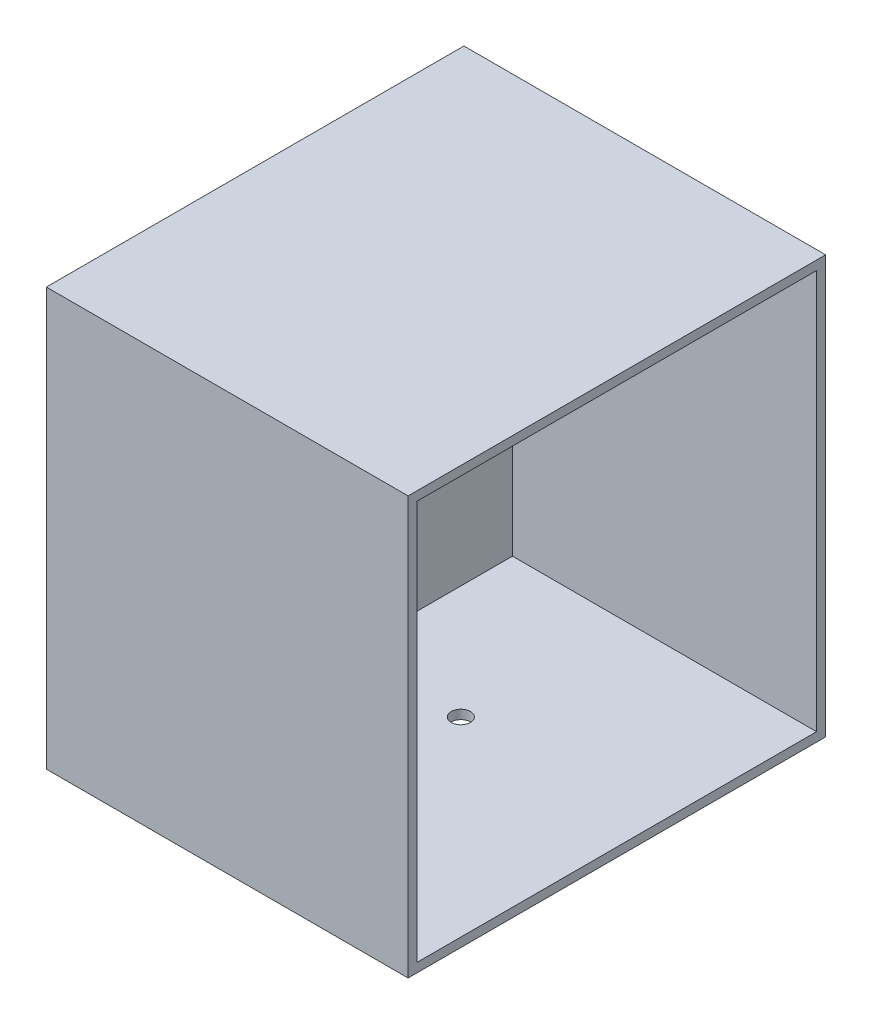
ISO-10303-21;
HEADER;
FILE_DESCRIPTION(('STEP AP214'),'2;1');
FILE_NAME('part.step','',(''),(''),'','','');
FILE_SCHEMA(('AUTOMOTIVE_DESIGN { 1 0 10303 214 1 1 1 1 }'));
ENDSEC;
DATA;
#1=APPLICATION_CONTEXT('core data for automotive mechanical design processes');
#2=APPLICATION_PROTOCOL_DEFINITION('international standard','automotive_design',2000,#1);
#3=PRODUCT_CONTEXT('',#1,'mechanical');
#4=PRODUCT('Part','Part','',(#3));
#5=PRODUCT_RELATED_PRODUCT_CATEGORY('part','',(#4));
#6=PRODUCT_DEFINITION_FORMATION('','',#4);
#7=PRODUCT_DEFINITION_CONTEXT('part definition',#1,'design');
#8=PRODUCT_DEFINITION('design','',#6,#7);
#9=PRODUCT_DEFINITION_SHAPE('','',#8);
#10=(LENGTH_UNIT() NAMED_UNIT(*) SI_UNIT(.MILLI.,.METRE.));
#11=(NAMED_UNIT(*) PLANE_ANGLE_UNIT() SI_UNIT($,.RADIAN.));
#12=(NAMED_UNIT(*) SI_UNIT($,.STERADIAN.) SOLID_ANGLE_UNIT());
#13=UNCERTAINTY_MEASURE_WITH_UNIT(LENGTH_MEASURE(1.E-05),#10,'distance_accuracy_value','');
#14=(GEOMETRIC_REPRESENTATION_CONTEXT(3) GLOBAL_UNCERTAINTY_ASSIGNED_CONTEXT((#13)) GLOBAL_UNIT_ASSIGNED_CONTEXT((#10,
#11,#12)) REPRESENTATION_CONTEXT('',''));
#15=CARTESIAN_POINT('',(0.,0.,0.));
#16=DIRECTION('',(0.,0.,1.));
#17=DIRECTION('',(1.,0.,0.));
#18=AXIS2_PLACEMENT_3D('',#15,#16,#17);
#19=CARTESIAN_POINT('',(12.7,0.,0.));
#20=DIRECTION('',(1.,0.,0.));
#21=DIRECTION('',(0.,0.,-1.));
#22=AXIS2_PLACEMENT_3D('',#19,#20,#21);
#23=PLANE('',#22);
#24=CARTESIAN_POINT('',(12.7,0.,0.));
#25=DIRECTION('',(1.,0.,0.));
#26=DIRECTION('',(0.,0.,-1.));
#27=AXIS2_PLACEMENT_3D('',#24,#25,#26);
#28=CIRCLE('',#27,27.305);
#29=CARTESIAN_POINT('',(12.7,0.,-27.305));
#30=VERTEX_POINT('',#29);
#31=EDGE_CURVE('E109',#30,#30,#28,.T.);
#32=ORIENTED_EDGE('',*,*,#31,.F.);
#33=EDGE_LOOP('',(#32));
#34=FACE_BOUND('',#33,.T.);
#35=DIRECTION('',(0.,1.,0.));
#36=VECTOR('',#35,1.);
#37=CARTESIAN_POINT('',(12.7,0.,44.));
#38=LINE('',#37,#36);
#39=CARTESIAN_POINT('',(12.7,-44.,44.));
#40=VERTEX_POINT('',#39);
#41=CARTESIAN_POINT('',(12.7,44.,44.));
#42=VERTEX_POINT('',#41);
#43=EDGE_CURVE('E50',#40,#42,#38,.T.);
#44=ORIENTED_EDGE('',*,*,#43,.F.);
#45=DIRECTION('',(0.,0.,1.));
#46=VECTOR('',#45,1.);
#47=CARTESIAN_POINT('',(12.7,-44.,0.));
#48=LINE('',#47,#46);
#49=CARTESIAN_POINT('',(12.7,-44.,-44.));
#50=VERTEX_POINT('',#49);
#51=EDGE_CURVE('E145',#50,#40,#48,.T.);
#52=ORIENTED_EDGE('',*,*,#51,.F.);
#53=DIRECTION('',(0.,1.,0.));
#54=VECTOR('',#53,1.);
#55=CARTESIAN_POINT('',(12.7,0.,-44.));
#56=LINE('',#55,#54);
#57=CARTESIAN_POINT('',(12.7,44.,-44.));
#58=VERTEX_POINT('',#57);
#59=EDGE_CURVE('E124',#50,#58,#56,.T.);
#60=ORIENTED_EDGE('',*,*,#59,.T.);
#61=DIRECTION('',(0.,0.,1.));
#62=VECTOR('',#61,1.);
#63=CARTESIAN_POINT('',(12.7,44.,0.));
#64=LINE('',#63,#62);
#65=EDGE_CURVE('E55',#58,#42,#64,.T.);
#66=ORIENTED_EDGE('',*,*,#65,.T.);
#67=EDGE_LOOP('',(#44,#52,#60,#66));
#68=FACE_BOUND('',#67,.T.);
#69=ADVANCED_FACE('F35',(#34,#68),#23,.T.);
#70=CARTESIAN_POINT('',(12.7,0.,46.));
#71=DIRECTION('',(0.,0.,1.));
#72=DIRECTION('',(1.,0.,0.));
#73=AXIS2_PLACEMENT_3D('',#70,#71,#72);
#74=PLANE('',#73);
#75=DIRECTION('',(0.,1.,0.));
#76=VECTOR('',#75,1.);
#77=CARTESIAN_POINT('',(0.,0.,46.));
#78=LINE('',#77,#76);
#79=CARTESIAN_POINT('',(0.,-46.,46.));
#80=VERTEX_POINT('',#79);
#81=CARTESIAN_POINT('',(0.,46.,46.));
#82=VERTEX_POINT('',#81);
#83=EDGE_CURVE('E164',#80,#82,#78,.T.);
#84=ORIENTED_EDGE('',*,*,#83,.F.);
#85=DIRECTION('',(-1.,0.,0.));
#86=VECTOR('',#85,1.);
#87=CARTESIAN_POINT('',(12.7,-46.,46.));
#88=LINE('',#87,#86);
#89=CARTESIAN_POINT('',(79.7,-46.,46.));
#90=VERTEX_POINT('',#89);
#91=EDGE_CURVE('E11',#90,#80,#88,.T.);
#92=ORIENTED_EDGE('',*,*,#91,.F.);
#93=DIRECTION('',(0.,-1.,0.));
#94=VECTOR('',#93,1.);
#95=CARTESIAN_POINT('',(79.7,0.,46.));
#96=LINE('',#95,#94);
#97=CARTESIAN_POINT('',(79.7,46.,46.));
#98=VERTEX_POINT('',#97);
#99=EDGE_CURVE('E112',#98,#90,#96,.T.);
#100=ORIENTED_EDGE('',*,*,#99,.F.);
#101=DIRECTION('',(-1.,0.,0.));
#102=VECTOR('',#101,1.);
#103=CARTESIAN_POINT('',(12.7,46.,46.));
#104=LINE('',#103,#102);
#105=EDGE_CURVE('E98',#98,#82,#104,.T.);
#106=ORIENTED_EDGE('',*,*,#105,.T.);
#107=EDGE_LOOP('',(#84,#92,#100,#106));
#108=FACE_BOUND('',#107,.T.);
#109=ADVANCED_FACE('F113',(#108),#74,.T.);
#110=CARTESIAN_POINT('',(12.7,-46.,0.));
#111=DIRECTION('',(0.,-1.,0.));
#112=DIRECTION('',(0.,0.,-1.));
#113=AXIS2_PLACEMENT_3D('',#110,#111,#112);
#114=PLANE('',#113);
#115=CARTESIAN_POINT('',(37.7,-46.,-7.61999999999999));
#116=DIRECTION('',(0.,-1.,0.));
#117=DIRECTION('',(0.,0.,-1.));
#118=AXIS2_PLACEMENT_3D('',#115,#116,#117);
#119=CIRCLE('',#118,2.1082);
#120=CARTESIAN_POINT('',(37.7,-46.,-9.72819999999999));
#121=VERTEX_POINT('',#120);
#122=EDGE_CURVE('E306',#121,#121,#119,.T.);
#123=ORIENTED_EDGE('',*,*,#122,.F.);
#124=EDGE_LOOP('',(#123));
#125=FACE_BOUND('',#124,.T.);
#126=CARTESIAN_POINT('',(37.7,-46.,7.62));
#127=DIRECTION('',(0.,-1.,0.));
#128=DIRECTION('',(0.,0.,-1.));
#129=AXIS2_PLACEMENT_3D('',#126,#127,#128);
#130=CIRCLE('',#129,2.1082);
#131=CARTESIAN_POINT('',(37.7,-46.,5.51180000000001));
#132=VERTEX_POINT('',#131);
#133=EDGE_CURVE('E308',#132,#132,#130,.T.);
#134=ORIENTED_EDGE('',*,*,#133,.F.);
#135=EDGE_LOOP('',(#134));
#136=FACE_BOUND('',#135,.T.);
#137=DIRECTION('',(0.,0.,1.));
#138=VECTOR('',#137,1.);
#139=CARTESIAN_POINT('',(0.,-46.,0.));
#140=LINE('',#139,#138);
#141=CARTESIAN_POINT('',(0.,-46.,-46.));
#142=VERTEX_POINT('',#141);
#143=EDGE_CURVE('E166',#142,#80,#140,.T.);
#144=ORIENTED_EDGE('',*,*,#143,.F.);
#145=DIRECTION('',(-1.,0.,0.));
#146=VECTOR('',#145,1.);
#147=CARTESIAN_POINT('',(12.7,-46.,-46.));
#148=LINE('',#147,#146);
#149=CARTESIAN_POINT('',(79.7,-46.,-46.));
#150=VERTEX_POINT('',#149);
#151=EDGE_CURVE('E43',#150,#142,#148,.T.);
#152=ORIENTED_EDGE('',*,*,#151,.F.);
#153=DIRECTION('',(0.,0.,-1.));
#154=VECTOR('',#153,1.);
#155=CARTESIAN_POINT('',(79.7,-46.,0.));
#156=LINE('',#155,#154);
#157=EDGE_CURVE('E117',#90,#150,#156,.T.);
#158=ORIENTED_EDGE('',*,*,#157,.F.);
#159=ORIENTED_EDGE('',*,*,#91,.T.);
#160=EDGE_LOOP('',(#144,#152,#158,#159));
#161=FACE_BOUND('',#160,.T.);
#162=ADVANCED_FACE('F180',(#125,#136,#161),#114,.T.);
#163=CARTESIAN_POINT('',(12.7,0.,-46.));
#164=DIRECTION('',(0.,0.,1.));
#165=DIRECTION('',(1.,0.,0.));
#166=AXIS2_PLACEMENT_3D('',#163,#164,#165);
#167=PLANE('',#166);
#168=DIRECTION('',(0.,1.,0.));
#169=VECTOR('',#168,1.);
#170=CARTESIAN_POINT('',(0.,0.,-46.));
#171=LINE('',#170,#169);
#172=CARTESIAN_POINT('',(0.,46.,-46.));
#173=VERTEX_POINT('',#172);
#174=EDGE_CURVE('E169',#142,#173,#171,.T.);
#175=ORIENTED_EDGE('',*,*,#174,.T.);
#176=DIRECTION('',(-1.,0.,0.));
#177=VECTOR('',#176,1.);
#178=CARTESIAN_POINT('',(12.7,46.,-46.));
#179=LINE('',#178,#177);
#180=CARTESIAN_POINT('',(79.7,46.,-46.));
#181=VERTEX_POINT('',#180);
#182=EDGE_CURVE('E108',#181,#173,#179,.T.);
#183=ORIENTED_EDGE('',*,*,#182,.F.);
#184=DIRECTION('',(0.,1.,0.));
#185=VECTOR('',#184,1.);
#186=CARTESIAN_POINT('',(79.7,0.,-46.));
#187=LINE('',#186,#185);
#188=EDGE_CURVE('E123',#150,#181,#187,.T.);
#189=ORIENTED_EDGE('',*,*,#188,.F.);
#190=ORIENTED_EDGE('',*,*,#151,.T.);
#191=EDGE_LOOP('',(#175,#183,#189,#190));
#192=FACE_BOUND('',#191,.T.);
#193=ADVANCED_FACE('F175',(#192),#167,.F.);
#194=CARTESIAN_POINT('',(12.7,0.,0.));
#195=DIRECTION('',(-1.,0.,0.));
#196=DIRECTION('',(0.,0.,1.));
#197=AXIS2_PLACEMENT_3D('',#194,#195,#196);
#198=CYLINDRICAL_SURFACE('',#197,27.305);
#199=ORIENTED_EDGE('',*,*,#31,.T.);
#200=EDGE_LOOP('',(#199));
#201=FACE_BOUND('',#200,.T.);
#202=CARTESIAN_POINT('',(0.,0.,0.));
#203=DIRECTION('',(1.,0.,0.));
#204=DIRECTION('',(0.,0.,-1.));
#205=AXIS2_PLACEMENT_3D('',#202,#203,#204);
#206=CIRCLE('',#205,27.305);
#207=CARTESIAN_POINT('',(0.,0.,-27.305));
#208=VERTEX_POINT('',#207);
#209=EDGE_CURVE('E159',#208,#208,#206,.T.);
#210=ORIENTED_EDGE('',*,*,#209,.F.);
#211=EDGE_LOOP('',(#210));
#212=FACE_BOUND('',#211,.T.);
#213=ADVANCED_FACE('F37',(#201,#212),#198,.F.);
#214=CARTESIAN_POINT('',(12.7,46.,0.));
#215=DIRECTION('',(0.,-1.,0.));
#216=DIRECTION('',(0.,0.,-1.));
#217=AXIS2_PLACEMENT_3D('',#214,#215,#216);
#218=PLANE('',#217);
#219=DIRECTION('',(0.,0.,1.));
#220=VECTOR('',#219,1.);
#221=CARTESIAN_POINT('',(0.,46.,0.));
#222=LINE('',#221,#220);
#223=EDGE_CURVE('E104',#173,#82,#222,.T.);
#224=ORIENTED_EDGE('',*,*,#223,.T.);
#225=ORIENTED_EDGE('',*,*,#105,.F.);
#226=DIRECTION('',(0.,0.,1.));
#227=VECTOR('',#226,1.);
#228=CARTESIAN_POINT('',(79.7,46.,0.));
#229=LINE('',#228,#227);
#230=EDGE_CURVE('E103',#181,#98,#229,.T.);
#231=ORIENTED_EDGE('',*,*,#230,.F.);
#232=ORIENTED_EDGE('',*,*,#182,.T.);
#233=EDGE_LOOP('',(#224,#225,#231,#232));
#234=FACE_BOUND('',#233,.T.);
#235=ADVANCED_FACE('F100',(#234),#218,.F.);
#236=CARTESIAN_POINT('',(0.,0.,0.));
#237=DIRECTION('',(1.,0.,0.));
#238=DIRECTION('',(0.,0.,-1.));
#239=AXIS2_PLACEMENT_3D('',#236,#237,#238);
#240=PLANE('',#239);
#241=ORIENTED_EDGE('',*,*,#209,.T.);
#242=EDGE_LOOP('',(#241));
#243=FACE_BOUND('',#242,.T.);
#244=ORIENTED_EDGE('',*,*,#83,.T.);
#245=ORIENTED_EDGE('',*,*,#223,.F.);
#246=ORIENTED_EDGE('',*,*,#174,.F.);
#247=ORIENTED_EDGE('',*,*,#143,.T.);
#248=EDGE_LOOP('',(#244,#245,#246,#247));
#249=FACE_BOUND('',#248,.T.);
#250=ADVANCED_FACE('F179',(#243,#249),#240,.F.);
#251=CARTESIAN_POINT('',(79.7,-44.,0.));
#252=DIRECTION('',(0.,-1.,0.));
#253=DIRECTION('',(0.,0.,-1.));
#254=AXIS2_PLACEMENT_3D('',#251,#252,#253);
#255=PLANE('',#254);
#256=CARTESIAN_POINT('',(37.7,-44.,-7.61999999999999));
#257=DIRECTION('',(0.,-1.,0.));
#258=DIRECTION('',(0.,0.,-1.));
#259=AXIS2_PLACEMENT_3D('',#256,#257,#258);
#260=CIRCLE('',#259,2.1082);
#261=CARTESIAN_POINT('',(37.7,-44.,-9.72819999999999));
#262=VERTEX_POINT('',#261);
#263=EDGE_CURVE('E304',#262,#262,#260,.T.);
#264=ORIENTED_EDGE('',*,*,#263,.T.);
#265=EDGE_LOOP('',(#264));
#266=FACE_BOUND('',#265,.T.);
#267=CARTESIAN_POINT('',(37.7,-44.,7.62));
#268=DIRECTION('',(0.,-1.,0.));
#269=DIRECTION('',(0.,0.,-1.));
#270=AXIS2_PLACEMENT_3D('',#267,#268,#269);
#271=CIRCLE('',#270,2.1082);
#272=CARTESIAN_POINT('',(37.7,-44.,5.51180000000001));
#273=VERTEX_POINT('',#272);
#274=EDGE_CURVE('E128',#273,#273,#271,.T.);
#275=ORIENTED_EDGE('',*,*,#274,.T.);
#276=EDGE_LOOP('',(#275));
#277=FACE_BOUND('',#276,.T.);
#278=ORIENTED_EDGE('',*,*,#51,.T.);
#279=DIRECTION('',(-1.,0.,0.));
#280=VECTOR('',#279,1.);
#281=CARTESIAN_POINT('',(79.7,-44.,44.));
#282=LINE('',#281,#280);
#283=CARTESIAN_POINT('',(79.7,-44.,44.));
#284=VERTEX_POINT('',#283);
#285=EDGE_CURVE('E157',#284,#40,#282,.T.);
#286=ORIENTED_EDGE('',*,*,#285,.F.);
#287=DIRECTION('',(0.,0.,1.));
#288=VECTOR('',#287,1.);
#289=CARTESIAN_POINT('',(79.7,-44.,0.));
#290=LINE('',#289,#288);
#291=CARTESIAN_POINT('',(79.7,-44.,-44.));
#292=VERTEX_POINT('',#291);
#293=EDGE_CURVE('E133',#292,#284,#290,.T.);
#294=ORIENTED_EDGE('',*,*,#293,.F.);
#295=DIRECTION('',(-1.,0.,0.));
#296=VECTOR('',#295,1.);
#297=CARTESIAN_POINT('',(79.7,-44.,-44.));
#298=LINE('',#297,#296);
#299=EDGE_CURVE('E144',#292,#50,#298,.T.);
#300=ORIENTED_EDGE('',*,*,#299,.T.);
#301=EDGE_LOOP('',(#278,#286,#294,#300));
#302=FACE_BOUND('',#301,.T.);
#303=ADVANCED_FACE('F199',(#266,#277,#302),#255,.F.);
#304=CARTESIAN_POINT('',(79.7,0.,44.));
#305=DIRECTION('',(0.,0.,1.));
#306=DIRECTION('',(1.,0.,0.));
#307=AXIS2_PLACEMENT_3D('',#304,#305,#306);
#308=PLANE('',#307);
#309=ORIENTED_EDGE('',*,*,#43,.T.);
#310=DIRECTION('',(-1.,0.,0.));
#311=VECTOR('',#310,1.);
#312=CARTESIAN_POINT('',(79.7,44.,44.));
#313=LINE('',#312,#311);
#314=CARTESIAN_POINT('',(79.7,44.,44.));
#315=VERTEX_POINT('',#314);
#316=EDGE_CURVE('E155',#315,#42,#313,.T.);
#317=ORIENTED_EDGE('',*,*,#316,.F.);
#318=DIRECTION('',(0.,1.,0.));
#319=VECTOR('',#318,1.);
#320=CARTESIAN_POINT('',(79.7,0.,44.));
#321=LINE('',#320,#319);
#322=EDGE_CURVE('E136',#284,#315,#321,.T.);
#323=ORIENTED_EDGE('',*,*,#322,.F.);
#324=ORIENTED_EDGE('',*,*,#285,.T.);
#325=EDGE_LOOP('',(#309,#317,#323,#324));
#326=FACE_BOUND('',#325,.T.);
#327=ADVANCED_FACE('F234',(#326),#308,.F.);
#328=CARTESIAN_POINT('',(79.7,44.,0.));
#329=DIRECTION('',(0.,-1.,0.));
#330=DIRECTION('',(0.,0.,-1.));
#331=AXIS2_PLACEMENT_3D('',#328,#329,#330);
#332=PLANE('',#331);
#333=ORIENTED_EDGE('',*,*,#65,.F.);
#334=DIRECTION('',(-1.,0.,0.));
#335=VECTOR('',#334,1.);
#336=CARTESIAN_POINT('',(79.7,44.,-44.));
#337=LINE('',#336,#335);
#338=CARTESIAN_POINT('',(79.7,44.,-44.));
#339=VERTEX_POINT('',#338);
#340=EDGE_CURVE('E152',#339,#58,#337,.T.);
#341=ORIENTED_EDGE('',*,*,#340,.F.);
#342=DIRECTION('',(0.,0.,1.));
#343=VECTOR('',#342,1.);
#344=CARTESIAN_POINT('',(79.7,44.,0.));
#345=LINE('',#344,#343);
#346=EDGE_CURVE('E138',#339,#315,#345,.T.);
#347=ORIENTED_EDGE('',*,*,#346,.T.);
#348=ORIENTED_EDGE('',*,*,#316,.T.);
#349=EDGE_LOOP('',(#333,#341,#347,#348));
#350=FACE_BOUND('',#349,.T.);
#351=ADVANCED_FACE('F239',(#350),#332,.T.);
#352=CARTESIAN_POINT('',(79.7,0.,-44.));
#353=DIRECTION('',(0.,0.,1.));
#354=DIRECTION('',(1.,0.,0.));
#355=AXIS2_PLACEMENT_3D('',#352,#353,#354);
#356=PLANE('',#355);
#357=ORIENTED_EDGE('',*,*,#59,.F.);
#358=ORIENTED_EDGE('',*,*,#299,.F.);
#359=DIRECTION('',(0.,1.,0.));
#360=VECTOR('',#359,1.);
#361=CARTESIAN_POINT('',(79.7,0.,-44.));
#362=LINE('',#361,#360);
#363=EDGE_CURVE('E141',#292,#339,#362,.T.);
#364=ORIENTED_EDGE('',*,*,#363,.T.);
#365=ORIENTED_EDGE('',*,*,#340,.T.);
#366=EDGE_LOOP('',(#357,#358,#364,#365));
#367=FACE_BOUND('',#366,.T.);
#368=ADVANCED_FACE('F249',(#367),#356,.T.);
#369=CARTESIAN_POINT('',(79.7,0.,0.));
#370=DIRECTION('',(1.,0.,0.));
#371=DIRECTION('',(0.,0.,-1.));
#372=AXIS2_PLACEMENT_3D('',#369,#370,#371);
#373=PLANE('',#372);
#374=ORIENTED_EDGE('',*,*,#230,.T.);
#375=ORIENTED_EDGE('',*,*,#99,.T.);
#376=ORIENTED_EDGE('',*,*,#157,.T.);
#377=ORIENTED_EDGE('',*,*,#188,.T.);
#378=EDGE_LOOP('',(#374,#375,#376,#377));
#379=FACE_BOUND('',#378,.T.);
#380=ORIENTED_EDGE('',*,*,#293,.T.);
#381=ORIENTED_EDGE('',*,*,#322,.T.);
#382=ORIENTED_EDGE('',*,*,#346,.F.);
#383=ORIENTED_EDGE('',*,*,#363,.F.);
#384=EDGE_LOOP('',(#380,#381,#382,#383));
#385=FACE_BOUND('',#384,.T.);
#386=ADVANCED_FACE('F120',(#379,#385),#373,.T.);
#387=CARTESIAN_POINT('',(37.7,-46.,7.62));
#388=DIRECTION('',(0.,-1.,0.));
#389=DIRECTION('',(0.,0.,-1.));
#390=AXIS2_PLACEMENT_3D('',#387,#388,#389);
#391=CYLINDRICAL_SURFACE('',#390,2.1082);
#392=ORIENTED_EDGE('',*,*,#274,.F.);
#393=EDGE_LOOP('',(#392));
#394=FACE_BOUND('',#393,.T.);
#395=ORIENTED_EDGE('',*,*,#133,.T.);
#396=EDGE_LOOP('',(#395));
#397=FACE_BOUND('',#396,.T.);
#398=ADVANCED_FACE('F267',(#394,#397),#391,.F.);
#399=CARTESIAN_POINT('',(37.7,-46.,-7.61999999999999));
#400=DIRECTION('',(0.,-1.,0.));
#401=DIRECTION('',(0.,0.,-1.));
#402=AXIS2_PLACEMENT_3D('',#399,#400,#401);
#403=CYLINDRICAL_SURFACE('',#402,2.1082);
#404=ORIENTED_EDGE('',*,*,#263,.F.);
#405=EDGE_LOOP('',(#404));
#406=FACE_BOUND('',#405,.T.);
#407=ORIENTED_EDGE('',*,*,#122,.T.);
#408=EDGE_LOOP('',(#407));
#409=FACE_BOUND('',#408,.T.);
#410=ADVANCED_FACE('F287',(#406,#409),#403,.F.);
#411=CLOSED_SHELL('',(#69,#109,#162,#193,#213,#235,#250,#303,#327,#351,#368,#386,#398,#410));
#412=MANIFOLD_SOLID_BREP('B2',#411);
#413=ADVANCED_BREP_SHAPE_REPRESENTATION('',(#18,#412),#14);
#414=SHAPE_DEFINITION_REPRESENTATION(#9,#413);
ENDSEC;
END-ISO-10303-21;
